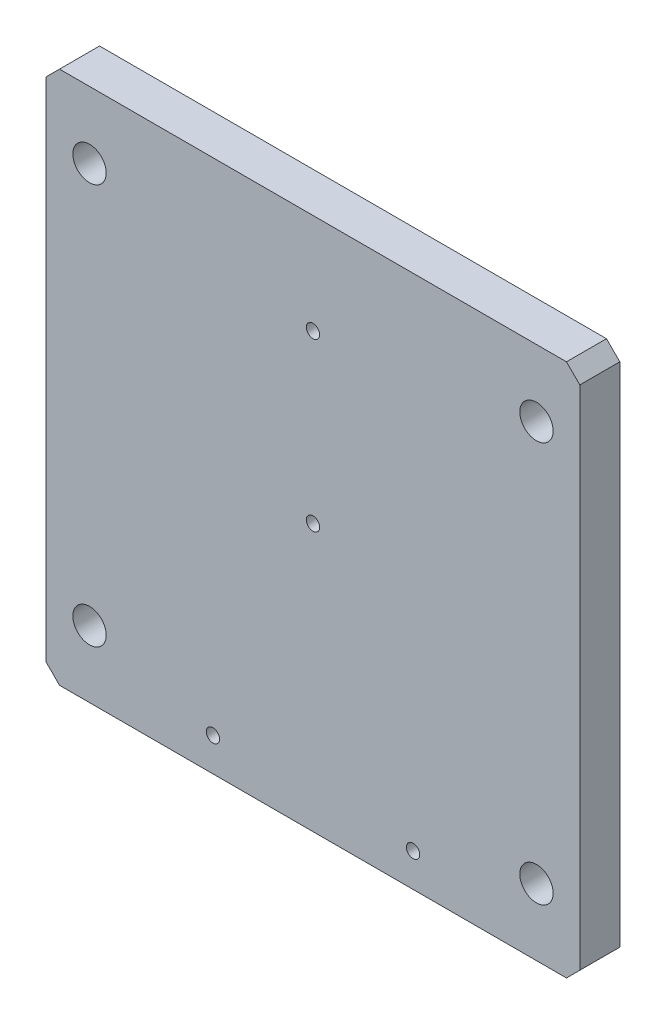
ISO-10303-21;
HEADER;
FILE_DESCRIPTION(('STEP AP214'),'2;1');
FILE_NAME('part.step','',(''),(''),'','','');
FILE_SCHEMA(('AUTOMOTIVE_DESIGN { 1 0 10303 214 1 1 1 1 }'));
ENDSEC;
DATA;
#1=APPLICATION_CONTEXT('core data for automotive mechanical design processes');
#2=APPLICATION_PROTOCOL_DEFINITION('international standard','automotive_design',2000,#1);
#3=PRODUCT_CONTEXT('',#1,'mechanical');
#4=PRODUCT('Part','Part','',(#3));
#5=PRODUCT_RELATED_PRODUCT_CATEGORY('part','',(#4));
#6=PRODUCT_DEFINITION_FORMATION('','',#4);
#7=PRODUCT_DEFINITION_CONTEXT('part definition',#1,'design');
#8=PRODUCT_DEFINITION('design','',#6,#7);
#9=PRODUCT_DEFINITION_SHAPE('','',#8);
#10=(LENGTH_UNIT() NAMED_UNIT(*) SI_UNIT(.MILLI.,.METRE.));
#11=(NAMED_UNIT(*) PLANE_ANGLE_UNIT() SI_UNIT($,.RADIAN.));
#12=(NAMED_UNIT(*) SI_UNIT($,.STERADIAN.) SOLID_ANGLE_UNIT());
#13=UNCERTAINTY_MEASURE_WITH_UNIT(LENGTH_MEASURE(1.E-05),#10,'distance_accuracy_value','');
#14=(GEOMETRIC_REPRESENTATION_CONTEXT(3) GLOBAL_UNCERTAINTY_ASSIGNED_CONTEXT((#13)) GLOBAL_UNIT_ASSIGNED_CONTEXT((#10,
#11,#12)) REPRESENTATION_CONTEXT('',''));
#15=CARTESIAN_POINT('',(0.,0.,0.));
#16=DIRECTION('',(0.,0.,1.));
#17=DIRECTION('',(1.,0.,0.));
#18=AXIS2_PLACEMENT_3D('',#15,#16,#17);
#19=CARTESIAN_POINT('',(0.,0.,0.));
#20=DIRECTION('',(0.,0.,1.));
#21=DIRECTION('',(1.,0.,0.));
#22=AXIS2_PLACEMENT_3D('',#19,#20,#21);
#23=PLANE('',#22);
#24=CARTESIAN_POINT('',(-33.5,30.,0.));
#25=DIRECTION('',(0.,0.,-1.));
#26=DIRECTION('',(-1.,0.,0.));
#27=AXIS2_PLACEMENT_3D('',#24,#25,#26);
#28=CIRCLE('',#27,2.49999999999999);
#29=CARTESIAN_POINT('',(-36.,30.,0.));
#30=VERTEX_POINT('',#29);
#31=EDGE_CURVE('E657',#30,#30,#28,.T.);
#32=ORIENTED_EDGE('',*,*,#31,.F.);
#33=EDGE_LOOP('',(#32));
#34=FACE_BOUND('',#33,.T.);
#35=CARTESIAN_POINT('',(33.5,-30.,0.));
#36=DIRECTION('',(0.,0.,-1.));
#37=DIRECTION('',(-1.,0.,0.));
#38=AXIS2_PLACEMENT_3D('',#35,#36,#37);
#39=CIRCLE('',#38,2.49999999999999);
#40=CARTESIAN_POINT('',(31.,-30.,0.));
#41=VERTEX_POINT('',#40);
#42=EDGE_CURVE('E651',#41,#41,#39,.T.);
#43=ORIENTED_EDGE('',*,*,#42,.F.);
#44=EDGE_LOOP('',(#43));
#45=FACE_BOUND('',#44,.T.);
#46=CARTESIAN_POINT('',(-33.5,-30.,0.));
#47=DIRECTION('',(0.,0.,-1.));
#48=DIRECTION('',(-1.,0.,0.));
#49=AXIS2_PLACEMENT_3D('',#46,#47,#48);
#50=CIRCLE('',#49,2.49999999999999);
#51=CARTESIAN_POINT('',(-36.,-30.,0.));
#52=VERTEX_POINT('',#51);
#53=EDGE_CURVE('E645',#52,#52,#50,.T.);
#54=ORIENTED_EDGE('',*,*,#53,.F.);
#55=EDGE_LOOP('',(#54));
#56=FACE_BOUND('',#55,.T.);
#57=CARTESIAN_POINT('',(33.5,30.,0.));
#58=DIRECTION('',(0.,0.,-1.));
#59=DIRECTION('',(-1.,0.,0.));
#60=AXIS2_PLACEMENT_3D('',#57,#58,#59);
#61=CIRCLE('',#60,2.49999999999999);
#62=CARTESIAN_POINT('',(31.,30.,0.));
#63=VERTEX_POINT('',#62);
#64=EDGE_CURVE('E639',#63,#63,#61,.T.);
#65=ORIENTED_EDGE('',*,*,#64,.F.);
#66=EDGE_LOOP('',(#65));
#67=FACE_BOUND('',#66,.T.);
#68=CARTESIAN_POINT('',(15.,-35.,0.));
#69=DIRECTION('',(0.,0.,-1.));
#70=DIRECTION('',(-1.,0.,0.));
#71=AXIS2_PLACEMENT_3D('',#68,#69,#70);
#72=CIRCLE('',#71,0.999999999999987);
#73=CARTESIAN_POINT('',(14.,-35.,0.));
#74=VERTEX_POINT('',#73);
#75=EDGE_CURVE('E621',#74,#74,#72,.T.);
#76=ORIENTED_EDGE('',*,*,#75,.F.);
#77=EDGE_LOOP('',(#76));
#78=FACE_BOUND('',#77,.T.);
#79=CARTESIAN_POINT('',(-15.,-35.,0.));
#80=DIRECTION('',(0.,0.,-1.));
#81=DIRECTION('',(-1.,0.,0.));
#82=AXIS2_PLACEMENT_3D('',#79,#80,#81);
#83=CIRCLE('',#82,0.999999999999987);
#84=CARTESIAN_POINT('',(-16.,-35.,0.));
#85=VERTEX_POINT('',#84);
#86=EDGE_CURVE('E614',#85,#85,#83,.T.);
#87=ORIENTED_EDGE('',*,*,#86,.F.);
#88=EDGE_LOOP('',(#87));
#89=FACE_BOUND('',#88,.T.);
#90=DIRECTION('',(0.,-1.,0.));
#91=VECTOR('',#90,1.);
#92=CARTESIAN_POINT('',(-40.,0.,0.));
#93=LINE('',#92,#91);
#94=CARTESIAN_POINT('',(-40.,38.,0.));
#95=VERTEX_POINT('',#94);
#96=CARTESIAN_POINT('',(-40.,-38.,0.));
#97=VERTEX_POINT('',#96);
#98=EDGE_CURVE('E226',#95,#97,#93,.T.);
#99=ORIENTED_EDGE('',*,*,#98,.F.);
#100=DIRECTION('',(0.707106781186545,0.70710678118655,0.));
#101=VECTOR('',#100,1.);
#102=CARTESIAN_POINT('',(-38.,40.,0.));
#103=LINE('',#102,#101);
#104=CARTESIAN_POINT('',(-38.,40.,0.));
#105=VERTEX_POINT('',#104);
#106=EDGE_CURVE('E191',#95,#105,#103,.T.);
#107=ORIENTED_EDGE('',*,*,#106,.T.);
#108=DIRECTION('',(1.,0.,0.));
#109=VECTOR('',#108,1.);
#110=CARTESIAN_POINT('',(0.,40.,0.));
#111=LINE('',#110,#109);
#112=CARTESIAN_POINT('',(38.,40.,0.));
#113=VERTEX_POINT('',#112);
#114=EDGE_CURVE('E154',#105,#113,#111,.T.);
#115=ORIENTED_EDGE('',*,*,#114,.T.);
#116=DIRECTION('',(-0.70710678118655,0.707106781186545,0.));
#117=VECTOR('',#116,1.);
#118=CARTESIAN_POINT('',(40.,38.,0.));
#119=LINE('',#118,#117);
#120=CARTESIAN_POINT('',(40.,38.,0.));
#121=VERTEX_POINT('',#120);
#122=EDGE_CURVE('E158',#113,#121,#119,.F.);
#123=ORIENTED_EDGE('',*,*,#122,.T.);
#124=DIRECTION('',(0.,-1.,0.));
#125=VECTOR('',#124,1.);
#126=CARTESIAN_POINT('',(40.,0.,0.));
#127=LINE('',#126,#125);
#128=CARTESIAN_POINT('',(40.,-38.,0.));
#129=VERTEX_POINT('',#128);
#130=EDGE_CURVE('E160',#121,#129,#127,.T.);
#131=ORIENTED_EDGE('',*,*,#130,.T.);
#132=DIRECTION('',(-0.707106781186545,-0.70710678118655,0.));
#133=VECTOR('',#132,1.);
#134=CARTESIAN_POINT('',(38.,-40.,0.));
#135=LINE('',#134,#133);
#136=CARTESIAN_POINT('',(38.,-40.,0.));
#137=VERTEX_POINT('',#136);
#138=EDGE_CURVE('E80',#129,#137,#135,.T.);
#139=ORIENTED_EDGE('',*,*,#138,.T.);
#140=DIRECTION('',(1.,0.,0.));
#141=VECTOR('',#140,1.);
#142=CARTESIAN_POINT('',(0.,-40.,0.));
#143=LINE('',#142,#141);
#144=CARTESIAN_POINT('',(-38.,-40.,0.));
#145=VERTEX_POINT('',#144);
#146=EDGE_CURVE('E166',#145,#137,#143,.T.);
#147=ORIENTED_EDGE('',*,*,#146,.F.);
#148=DIRECTION('',(0.70710678118655,-0.707106781186545,0.));
#149=VECTOR('',#148,1.);
#150=CARTESIAN_POINT('',(-40.,-38.,0.));
#151=LINE('',#150,#149);
#152=EDGE_CURVE('E184',#145,#97,#151,.F.);
#153=ORIENTED_EDGE('',*,*,#152,.T.);
#154=EDGE_LOOP('',(#99,#107,#115,#123,#131,#139,#147,#153));
#155=FACE_BOUND('',#154,.T.);
#156=CARTESIAN_POINT('',(0.,0.,0.));
#157=DIRECTION('',(0.,0.,-1.));
#158=DIRECTION('',(-1.,0.,0.));
#159=AXIS2_PLACEMENT_3D('',#156,#157,#158);
#160=CIRCLE('',#159,0.999999999999987);
#161=CARTESIAN_POINT('',(-0.999999999999987,0.,0.));
#162=VERTEX_POINT('',#161);
#163=EDGE_CURVE('E627',#162,#162,#160,.T.);
#164=ORIENTED_EDGE('',*,*,#163,.F.);
#165=EDGE_LOOP('',(#164));
#166=FACE_BOUND('',#165,.T.);
#167=CARTESIAN_POINT('',(0.,25.,0.));
#168=DIRECTION('',(0.,0.,-1.));
#169=DIRECTION('',(-1.,0.,0.));
#170=AXIS2_PLACEMENT_3D('',#167,#168,#169);
#171=CIRCLE('',#170,0.999999999999987);
#172=CARTESIAN_POINT('',(-0.999999999999988,25.,0.));
#173=VERTEX_POINT('',#172);
#174=EDGE_CURVE('E633',#173,#173,#171,.T.);
#175=ORIENTED_EDGE('',*,*,#174,.F.);
#176=EDGE_LOOP('',(#175));
#177=FACE_BOUND('',#176,.T.);
#178=ADVANCED_FACE('F63',(#34,#45,#56,#67,#78,#89,#155,#166,#177),#23,.F.);
#179=CARTESIAN_POINT('',(0.,40.,3.));
#180=DIRECTION('',(0.,1.,0.));
#181=DIRECTION('',(0.,0.,1.));
#182=AXIS2_PLACEMENT_3D('',#179,#180,#181);
#183=PLANE('',#182);
#184=ORIENTED_EDGE('',*,*,#114,.F.);
#185=DIRECTION('',(0.,0.,1.));
#186=VECTOR('',#185,1.);
#187=CARTESIAN_POINT('',(-38.,40.,6.));
#188=LINE('',#187,#186);
#189=CARTESIAN_POINT('',(-38.,40.,6.));
#190=VERTEX_POINT('',#189);
#191=EDGE_CURVE('E152',#105,#190,#188,.T.);
#192=ORIENTED_EDGE('',*,*,#191,.T.);
#193=DIRECTION('',(-1.,0.,0.));
#194=VECTOR('',#193,1.);
#195=CARTESIAN_POINT('',(40.,40.,6.));
#196=LINE('',#195,#194);
#197=CARTESIAN_POINT('',(38.,40.,6.));
#198=VERTEX_POINT('',#197);
#199=EDGE_CURVE('E134',#198,#190,#196,.T.);
#200=ORIENTED_EDGE('',*,*,#199,.F.);
#201=DIRECTION('',(0.,0.,-1.));
#202=VECTOR('',#201,1.);
#203=CARTESIAN_POINT('',(38.,40.,3.));
#204=LINE('',#203,#202);
#205=EDGE_CURVE('E149',#198,#113,#204,.T.);
#206=ORIENTED_EDGE('',*,*,#205,.T.);
#207=EDGE_LOOP('',(#184,#192,#200,#206));
#208=FACE_BOUND('',#207,.T.);
#209=ADVANCED_FACE('F148',(#208),#183,.T.);
#210=CARTESIAN_POINT('',(-40.,0.,3.));
#211=DIRECTION('',(1.,0.,0.));
#212=DIRECTION('',(0.,1.,0.));
#213=AXIS2_PLACEMENT_3D('',#210,#211,#212);
#214=PLANE('',#213);
#215=DIRECTION('',(0.,-1.,0.));
#216=VECTOR('',#215,1.);
#217=CARTESIAN_POINT('',(-40.,40.,6.));
#218=LINE('',#217,#216);
#219=CARTESIAN_POINT('',(-40.,38.,6.));
#220=VERTEX_POINT('',#219);
#221=CARTESIAN_POINT('',(-40.,-38.,6.));
#222=VERTEX_POINT('',#221);
#223=EDGE_CURVE('E214',#220,#222,#218,.T.);
#224=ORIENTED_EDGE('',*,*,#223,.F.);
#225=DIRECTION('',(0.,0.,-1.));
#226=VECTOR('',#225,1.);
#227=CARTESIAN_POINT('',(-40.,38.,0.));
#228=LINE('',#227,#226);
#229=EDGE_CURVE('E181',#220,#95,#228,.T.);
#230=ORIENTED_EDGE('',*,*,#229,.T.);
#231=ORIENTED_EDGE('',*,*,#98,.T.);
#232=DIRECTION('',(0.,0.,1.));
#233=VECTOR('',#232,1.);
#234=CARTESIAN_POINT('',(-40.,-38.,3.));
#235=LINE('',#234,#233);
#236=EDGE_CURVE('E177',#97,#222,#235,.T.);
#237=ORIENTED_EDGE('',*,*,#236,.T.);
#238=EDGE_LOOP('',(#224,#230,#231,#237));
#239=FACE_BOUND('',#238,.T.);
#240=ADVANCED_FACE('F330',(#239),#214,.F.);
#241=CARTESIAN_POINT('',(0.,-40.,3.));
#242=DIRECTION('',(0.,1.,0.));
#243=DIRECTION('',(0.,0.,1.));
#244=AXIS2_PLACEMENT_3D('',#241,#242,#243);
#245=PLANE('',#244);
#246=ORIENTED_EDGE('',*,*,#146,.T.);
#247=DIRECTION('',(0.,0.,1.));
#248=VECTOR('',#247,1.);
#249=CARTESIAN_POINT('',(38.,-40.,6.));
#250=LINE('',#249,#248);
#251=CARTESIAN_POINT('',(38.,-40.,6.));
#252=VERTEX_POINT('',#251);
#253=EDGE_CURVE('E12',#137,#252,#250,.T.);
#254=ORIENTED_EDGE('',*,*,#253,.T.);
#255=DIRECTION('',(1.,0.,0.));
#256=VECTOR('',#255,1.);
#257=CARTESIAN_POINT('',(-40.,-40.,6.));
#258=LINE('',#257,#256);
#259=CARTESIAN_POINT('',(-38.,-40.,6.));
#260=VERTEX_POINT('',#259);
#261=EDGE_CURVE('E211',#260,#252,#258,.T.);
#262=ORIENTED_EDGE('',*,*,#261,.F.);
#263=DIRECTION('',(0.,0.,-1.));
#264=VECTOR('',#263,1.);
#265=CARTESIAN_POINT('',(-38.,-40.,3.));
#266=LINE('',#265,#264);
#267=EDGE_CURVE('E73',#260,#145,#266,.T.);
#268=ORIENTED_EDGE('',*,*,#267,.T.);
#269=EDGE_LOOP('',(#246,#254,#262,#268));
#270=FACE_BOUND('',#269,.T.);
#271=ADVANCED_FACE('F210',(#270),#245,.F.);
#272=CARTESIAN_POINT('',(40.,0.,3.));
#273=DIRECTION('',(1.,0.,0.));
#274=DIRECTION('',(0.,1.,0.));
#275=AXIS2_PLACEMENT_3D('',#272,#273,#274);
#276=PLANE('',#275);
#277=ORIENTED_EDGE('',*,*,#130,.F.);
#278=DIRECTION('',(0.,0.,1.));
#279=VECTOR('',#278,1.);
#280=CARTESIAN_POINT('',(40.,38.,3.));
#281=LINE('',#280,#279);
#282=CARTESIAN_POINT('',(40.,38.,6.));
#283=VERTEX_POINT('',#282);
#284=EDGE_CURVE('E197',#121,#283,#281,.T.);
#285=ORIENTED_EDGE('',*,*,#284,.T.);
#286=DIRECTION('',(0.,1.,0.));
#287=VECTOR('',#286,1.);
#288=CARTESIAN_POINT('',(40.,-40.,6.));
#289=LINE('',#288,#287);
#290=CARTESIAN_POINT('',(40.,-38.,6.));
#291=VERTEX_POINT('',#290);
#292=EDGE_CURVE('E136',#291,#283,#289,.T.);
#293=ORIENTED_EDGE('',*,*,#292,.F.);
#294=DIRECTION('',(0.,0.,-1.));
#295=VECTOR('',#294,1.);
#296=CARTESIAN_POINT('',(40.,-38.,0.));
#297=LINE('',#296,#295);
#298=EDGE_CURVE('E194',#291,#129,#297,.T.);
#299=ORIENTED_EDGE('',*,*,#298,.T.);
#300=EDGE_LOOP('',(#277,#285,#293,#299));
#301=FACE_BOUND('',#300,.T.);
#302=ADVANCED_FACE('F202',(#301),#276,.T.);
#303=CARTESIAN_POINT('',(0.,0.,6.));
#304=DIRECTION('',(0.,0.,1.));
#305=DIRECTION('',(1.,0.,0.));
#306=AXIS2_PLACEMENT_3D('',#303,#304,#305);
#307=PLANE('',#306);
#308=CARTESIAN_POINT('',(-33.5,30.,6.00000000000001));
#309=DIRECTION('',(0.,0.,-1.));
#310=DIRECTION('',(-1.,0.,0.));
#311=AXIS2_PLACEMENT_3D('',#308,#309,#310);
#312=CIRCLE('',#311,2.49999999999999);
#313=CARTESIAN_POINT('',(-36.,30.,6.00000000000001));
#314=VERTEX_POINT('',#313);
#315=EDGE_CURVE('E585',#314,#314,#312,.T.);
#316=ORIENTED_EDGE('',*,*,#315,.T.);
#317=EDGE_LOOP('',(#316));
#318=FACE_BOUND('',#317,.T.);
#319=CARTESIAN_POINT('',(33.5,-30.,6.00000000000001));
#320=DIRECTION('',(0.,0.,-1.));
#321=DIRECTION('',(-1.,0.,0.));
#322=AXIS2_PLACEMENT_3D('',#319,#320,#321);
#323=CIRCLE('',#322,2.49999999999999);
#324=CARTESIAN_POINT('',(31.,-30.,6.00000000000001));
#325=VERTEX_POINT('',#324);
#326=EDGE_CURVE('E589',#325,#325,#323,.T.);
#327=ORIENTED_EDGE('',*,*,#326,.T.);
#328=EDGE_LOOP('',(#327));
#329=FACE_BOUND('',#328,.T.);
#330=CARTESIAN_POINT('',(-33.5,-30.,6.00000000000001));
#331=DIRECTION('',(0.,0.,-1.));
#332=DIRECTION('',(-1.,0.,0.));
#333=AXIS2_PLACEMENT_3D('',#330,#331,#332);
#334=CIRCLE('',#333,2.49999999999999);
#335=CARTESIAN_POINT('',(-36.,-30.,6.00000000000001));
#336=VERTEX_POINT('',#335);
#337=EDGE_CURVE('E593',#336,#336,#334,.T.);
#338=ORIENTED_EDGE('',*,*,#337,.T.);
#339=EDGE_LOOP('',(#338));
#340=FACE_BOUND('',#339,.T.);
#341=CARTESIAN_POINT('',(33.5,30.,6.00000000000001));
#342=DIRECTION('',(0.,0.,-1.));
#343=DIRECTION('',(-1.,0.,0.));
#344=AXIS2_PLACEMENT_3D('',#341,#342,#343);
#345=CIRCLE('',#344,2.49999999999999);
#346=CARTESIAN_POINT('',(31.,30.,6.00000000000001));
#347=VERTEX_POINT('',#346);
#348=EDGE_CURVE('E597',#347,#347,#345,.T.);
#349=ORIENTED_EDGE('',*,*,#348,.T.);
#350=EDGE_LOOP('',(#349));
#351=FACE_BOUND('',#350,.T.);
#352=CARTESIAN_POINT('',(0.,25.,6.));
#353=DIRECTION('',(0.,0.,1.));
#354=DIRECTION('',(1.,0.,0.));
#355=AXIS2_PLACEMENT_3D('',#352,#353,#354);
#356=CIRCLE('',#355,0.999999999999993);
#357=CARTESIAN_POINT('',(0.999999999999992,25.,6.));
#358=VERTEX_POINT('',#357);
#359=EDGE_CURVE('E601',#358,#358,#356,.T.);
#360=ORIENTED_EDGE('',*,*,#359,.F.);
#361=EDGE_LOOP('',(#360));
#362=FACE_BOUND('',#361,.T.);
#363=CARTESIAN_POINT('',(0.,0.,6.));
#364=DIRECTION('',(0.,0.,1.));
#365=DIRECTION('',(1.,0.,0.));
#366=AXIS2_PLACEMENT_3D('',#363,#364,#365);
#367=CIRCLE('',#366,0.999999999999993);
#368=CARTESIAN_POINT('',(0.999999999999993,0.,6.));
#369=VERTEX_POINT('',#368);
#370=EDGE_CURVE('E605',#369,#369,#367,.T.);
#371=ORIENTED_EDGE('',*,*,#370,.F.);
#372=EDGE_LOOP('',(#371));
#373=FACE_BOUND('',#372,.T.);
#374=CARTESIAN_POINT('',(15.,-35.,6.));
#375=DIRECTION('',(0.,0.,1.));
#376=DIRECTION('',(1.,0.,0.));
#377=AXIS2_PLACEMENT_3D('',#374,#375,#376);
#378=CIRCLE('',#377,0.999999999999992);
#379=CARTESIAN_POINT('',(16.,-35.,6.));
#380=VERTEX_POINT('',#379);
#381=EDGE_CURVE('E609',#380,#380,#378,.T.);
#382=ORIENTED_EDGE('',*,*,#381,.F.);
#383=EDGE_LOOP('',(#382));
#384=FACE_BOUND('',#383,.T.);
#385=CARTESIAN_POINT('',(-15.,-35.,6.));
#386=DIRECTION('',(0.,0.,1.));
#387=DIRECTION('',(1.,0.,0.));
#388=AXIS2_PLACEMENT_3D('',#385,#386,#387);
#389=CIRCLE('',#388,0.999999999999993);
#390=CARTESIAN_POINT('',(-14.,-35.,6.));
#391=VERTEX_POINT('',#390);
#392=EDGE_CURVE('E219',#391,#391,#389,.T.);
#393=ORIENTED_EDGE('',*,*,#392,.F.);
#394=EDGE_LOOP('',(#393));
#395=FACE_BOUND('',#394,.T.);
#396=ORIENTED_EDGE('',*,*,#199,.T.);
#397=DIRECTION('',(-0.707106781186545,-0.70710678118655,0.));
#398=VECTOR('',#397,1.);
#399=CARTESIAN_POINT('',(-39.0000000000001,38.9999999999999,6.));
#400=LINE('',#399,#398);
#401=EDGE_CURVE('E142',#190,#220,#400,.T.);
#402=ORIENTED_EDGE('',*,*,#401,.T.);
#403=ORIENTED_EDGE('',*,*,#223,.T.);
#404=DIRECTION('',(-0.70710678118655,0.707106781186545,0.));
#405=VECTOR('',#404,1.);
#406=CARTESIAN_POINT('',(-38.9999999999999,-39.0000000000001,6.));
#407=LINE('',#406,#405);
#408=EDGE_CURVE('E164',#222,#260,#407,.F.);
#409=ORIENTED_EDGE('',*,*,#408,.T.);
#410=ORIENTED_EDGE('',*,*,#261,.T.);
#411=DIRECTION('',(0.707106781186545,0.70710678118655,0.));
#412=VECTOR('',#411,1.);
#413=CARTESIAN_POINT('',(39.0000000000001,-38.9999999999999,6.));
#414=LINE('',#413,#412);
#415=EDGE_CURVE('E143',#252,#291,#414,.T.);
#416=ORIENTED_EDGE('',*,*,#415,.T.);
#417=ORIENTED_EDGE('',*,*,#292,.T.);
#418=DIRECTION('',(0.70710678118655,-0.707106781186545,0.));
#419=VECTOR('',#418,1.);
#420=CARTESIAN_POINT('',(38.9999999999999,39.0000000000001,6.));
#421=LINE('',#420,#419);
#422=EDGE_CURVE('E131',#283,#198,#421,.F.);
#423=ORIENTED_EDGE('',*,*,#422,.T.);
#424=EDGE_LOOP('',(#396,#402,#403,#409,#410,#416,#417,#423));
#425=FACE_BOUND('',#424,.T.);
#426=ADVANCED_FACE('F133',(#318,#329,#340,#351,#362,#373,#384,#395,#425),#307,.T.);
#427=CARTESIAN_POINT('',(-15.,-35.,0.));
#428=DIRECTION('',(0.,0.,-1.));
#429=DIRECTION('',(-1.,0.,0.));
#430=AXIS2_PLACEMENT_3D('',#427,#428,#429);
#431=CYLINDRICAL_SURFACE('',#430,0.999999999999993);
#432=ORIENTED_EDGE('',*,*,#86,.T.);
#433=EDGE_LOOP('',(#432));
#434=FACE_BOUND('',#433,.T.);
#435=ORIENTED_EDGE('',*,*,#392,.T.);
#436=EDGE_LOOP('',(#435));
#437=FACE_BOUND('',#436,.T.);
#438=ADVANCED_FACE('F460',(#434,#437),#431,.F.);
#439=CARTESIAN_POINT('',(15.,-35.,0.));
#440=DIRECTION('',(0.,0.,-1.));
#441=DIRECTION('',(-1.,0.,0.));
#442=AXIS2_PLACEMENT_3D('',#439,#440,#441);
#443=CYLINDRICAL_SURFACE('',#442,0.999999999999992);
#444=ORIENTED_EDGE('',*,*,#75,.T.);
#445=EDGE_LOOP('',(#444));
#446=FACE_BOUND('',#445,.T.);
#447=ORIENTED_EDGE('',*,*,#381,.T.);
#448=EDGE_LOOP('',(#447));
#449=FACE_BOUND('',#448,.T.);
#450=ADVANCED_FACE('F451',(#446,#449),#443,.F.);
#451=CARTESIAN_POINT('',(0.,0.,0.));
#452=DIRECTION('',(0.,0.,-1.));
#453=DIRECTION('',(-1.,0.,0.));
#454=AXIS2_PLACEMENT_3D('',#451,#452,#453);
#455=CYLINDRICAL_SURFACE('',#454,0.999999999999993);
#456=ORIENTED_EDGE('',*,*,#163,.T.);
#457=EDGE_LOOP('',(#456));
#458=FACE_BOUND('',#457,.T.);
#459=ORIENTED_EDGE('',*,*,#370,.T.);
#460=EDGE_LOOP('',(#459));
#461=FACE_BOUND('',#460,.T.);
#462=ADVANCED_FACE('F442',(#458,#461),#455,.F.);
#463=CARTESIAN_POINT('',(0.,25.,0.));
#464=DIRECTION('',(0.,0.,-1.));
#465=DIRECTION('',(-1.,0.,0.));
#466=AXIS2_PLACEMENT_3D('',#463,#464,#465);
#467=CYLINDRICAL_SURFACE('',#466,0.999999999999993);
#468=ORIENTED_EDGE('',*,*,#174,.T.);
#469=EDGE_LOOP('',(#468));
#470=FACE_BOUND('',#469,.T.);
#471=ORIENTED_EDGE('',*,*,#359,.T.);
#472=EDGE_LOOP('',(#471));
#473=FACE_BOUND('',#472,.T.);
#474=ADVANCED_FACE('F432',(#470,#473),#467,.F.);
#475=CARTESIAN_POINT('',(33.5,30.,0.));
#476=DIRECTION('',(0.,0.,-1.));
#477=DIRECTION('',(-1.,0.,0.));
#478=AXIS2_PLACEMENT_3D('',#475,#476,#477);
#479=CYLINDRICAL_SURFACE('',#478,2.49999999999999);
#480=ORIENTED_EDGE('',*,*,#348,.F.);
#481=EDGE_LOOP('',(#480));
#482=FACE_BOUND('',#481,.T.);
#483=ORIENTED_EDGE('',*,*,#64,.T.);
#484=EDGE_LOOP('',(#483));
#485=FACE_BOUND('',#484,.T.);
#486=ADVANCED_FACE('F422',(#482,#485),#479,.F.);
#487=CARTESIAN_POINT('',(-33.5,-30.,0.));
#488=DIRECTION('',(0.,0.,-1.));
#489=DIRECTION('',(-1.,0.,0.));
#490=AXIS2_PLACEMENT_3D('',#487,#488,#489);
#491=CYLINDRICAL_SURFACE('',#490,2.49999999999999);
#492=ORIENTED_EDGE('',*,*,#337,.F.);
#493=EDGE_LOOP('',(#492));
#494=FACE_BOUND('',#493,.T.);
#495=ORIENTED_EDGE('',*,*,#53,.T.);
#496=EDGE_LOOP('',(#495));
#497=FACE_BOUND('',#496,.T.);
#498=ADVANCED_FACE('F412',(#494,#497),#491,.F.);
#499=CARTESIAN_POINT('',(33.5,-30.,0.));
#500=DIRECTION('',(0.,0.,-1.));
#501=DIRECTION('',(-1.,0.,0.));
#502=AXIS2_PLACEMENT_3D('',#499,#500,#501);
#503=CYLINDRICAL_SURFACE('',#502,2.49999999999999);
#504=ORIENTED_EDGE('',*,*,#326,.F.);
#505=EDGE_LOOP('',(#504));
#506=FACE_BOUND('',#505,.T.);
#507=ORIENTED_EDGE('',*,*,#42,.T.);
#508=EDGE_LOOP('',(#507));
#509=FACE_BOUND('',#508,.T.);
#510=ADVANCED_FACE('F403',(#506,#509),#503,.F.);
#511=CARTESIAN_POINT('',(-33.5,30.,0.));
#512=DIRECTION('',(0.,0.,-1.));
#513=DIRECTION('',(-1.,0.,0.));
#514=AXIS2_PLACEMENT_3D('',#511,#512,#513);
#515=CYLINDRICAL_SURFACE('',#514,2.49999999999999);
#516=ORIENTED_EDGE('',*,*,#315,.F.);
#517=EDGE_LOOP('',(#516));
#518=FACE_BOUND('',#517,.T.);
#519=ORIENTED_EDGE('',*,*,#31,.T.);
#520=EDGE_LOOP('',(#519));
#521=FACE_BOUND('',#520,.T.);
#522=ADVANCED_FACE('F365',(#518,#521),#515,.F.);
#523=CARTESIAN_POINT('',(-38.,40.,3.));
#524=DIRECTION('',(-0.70710678118655,0.707106781186545,0.));
#525=DIRECTION('',(0.,0.,-1.));
#526=AXIS2_PLACEMENT_3D('',#523,#524,#525);
#527=PLANE('',#526);
#528=ORIENTED_EDGE('',*,*,#106,.F.);
#529=ORIENTED_EDGE('',*,*,#229,.F.);
#530=ORIENTED_EDGE('',*,*,#401,.F.);
#531=ORIENTED_EDGE('',*,*,#191,.F.);
#532=EDGE_LOOP('',(#528,#529,#530,#531));
#533=FACE_BOUND('',#532,.T.);
#534=ADVANCED_FACE('F359',(#533),#527,.T.);
#535=CARTESIAN_POINT('',(40.,38.,3.));
#536=DIRECTION('',(-0.707106781186545,-0.70710678118655,0.));
#537=DIRECTION('',(0.,0.,1.));
#538=AXIS2_PLACEMENT_3D('',#535,#536,#537);
#539=PLANE('',#538);
#540=ORIENTED_EDGE('',*,*,#122,.F.);
#541=ORIENTED_EDGE('',*,*,#205,.F.);
#542=ORIENTED_EDGE('',*,*,#422,.F.);
#543=ORIENTED_EDGE('',*,*,#284,.F.);
#544=EDGE_LOOP('',(#540,#541,#542,#543));
#545=FACE_BOUND('',#544,.T.);
#546=ADVANCED_FACE('F157',(#545),#539,.F.);
#547=CARTESIAN_POINT('',(38.,-40.,3.));
#548=DIRECTION('',(0.70710678118655,-0.707106781186545,0.));
#549=DIRECTION('',(0.,0.,-1.));
#550=AXIS2_PLACEMENT_3D('',#547,#548,#549);
#551=PLANE('',#550);
#552=ORIENTED_EDGE('',*,*,#138,.F.);
#553=ORIENTED_EDGE('',*,*,#298,.F.);
#554=ORIENTED_EDGE('',*,*,#415,.F.);
#555=ORIENTED_EDGE('',*,*,#253,.F.);
#556=EDGE_LOOP('',(#552,#553,#554,#555));
#557=FACE_BOUND('',#556,.T.);
#558=ADVANCED_FACE('F208',(#557),#551,.T.);
#559=CARTESIAN_POINT('',(-40.,-38.,3.));
#560=DIRECTION('',(0.707106781186545,0.70710678118655,0.));
#561=DIRECTION('',(0.,0.,1.));
#562=AXIS2_PLACEMENT_3D('',#559,#560,#561);
#563=PLANE('',#562);
#564=ORIENTED_EDGE('',*,*,#152,.F.);
#565=ORIENTED_EDGE('',*,*,#267,.F.);
#566=ORIENTED_EDGE('',*,*,#408,.F.);
#567=ORIENTED_EDGE('',*,*,#236,.F.);
#568=EDGE_LOOP('',(#564,#565,#566,#567));
#569=FACE_BOUND('',#568,.T.);
#570=ADVANCED_FACE('F66',(#569),#563,.F.);
#571=CLOSED_SHELL('',(#178,#209,#240,#271,#302,#426,#438,#450,#462,#474,#486,#498,#510,#522,
#534,#546,#558,#570));
#572=MANIFOLD_SOLID_BREP('B2',#571);
#573=ADVANCED_BREP_SHAPE_REPRESENTATION('',(#18,#572),#14);
#574=SHAPE_DEFINITION_REPRESENTATION(#9,#573);
ENDSEC;
END-ISO-10303-21;
